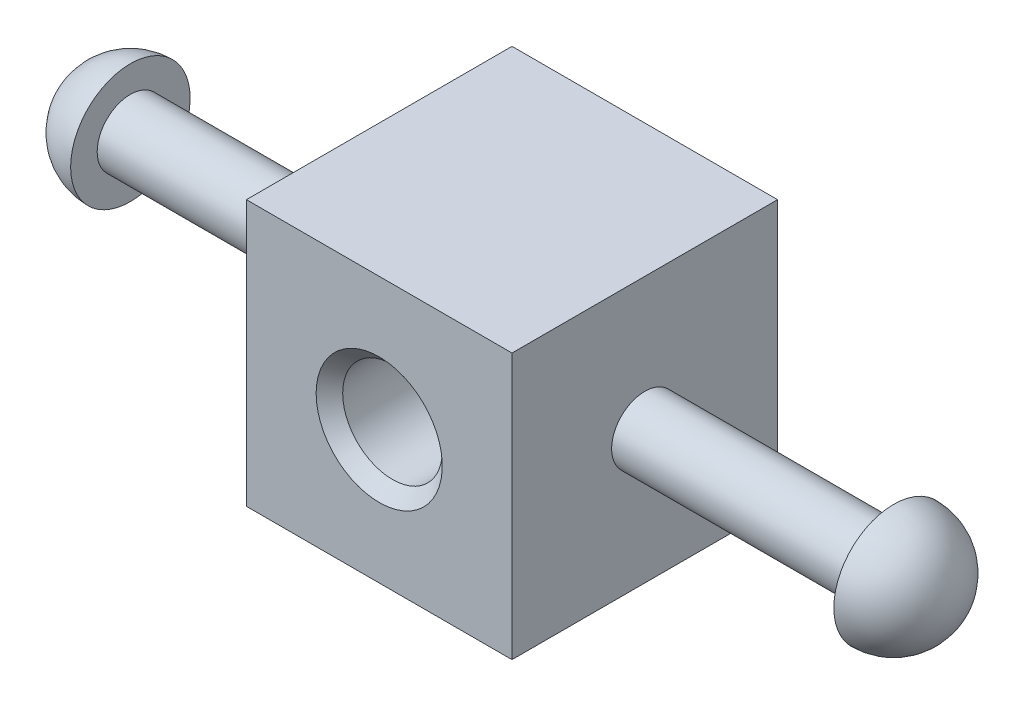
ISO-10303-21;
HEADER;
FILE_DESCRIPTION(('STEP AP214'),'2;1');
FILE_NAME('part.step','',(''),(''),'','','');
FILE_SCHEMA(('AUTOMOTIVE_DESIGN { 1 0 10303 214 1 1 1 1 }'));
ENDSEC;
DATA;
#1=APPLICATION_CONTEXT('core data for automotive mechanical design processes');
#2=APPLICATION_PROTOCOL_DEFINITION('international standard','automotive_design',2000,#1);
#3=PRODUCT_CONTEXT('',#1,'mechanical');
#4=PRODUCT('Part','Part','',(#3));
#5=PRODUCT_RELATED_PRODUCT_CATEGORY('part','',(#4));
#6=PRODUCT_DEFINITION_FORMATION('','',#4);
#7=PRODUCT_DEFINITION_CONTEXT('part definition',#1,'design');
#8=PRODUCT_DEFINITION('design','',#6,#7);
#9=PRODUCT_DEFINITION_SHAPE('','',#8);
#10=(LENGTH_UNIT() NAMED_UNIT(*) SI_UNIT(.MILLI.,.METRE.));
#11=(NAMED_UNIT(*) PLANE_ANGLE_UNIT() SI_UNIT($,.RADIAN.));
#12=(NAMED_UNIT(*) SI_UNIT($,.STERADIAN.) SOLID_ANGLE_UNIT());
#13=UNCERTAINTY_MEASURE_WITH_UNIT(LENGTH_MEASURE(1.E-05),#10,'distance_accuracy_value','');
#14=(GEOMETRIC_REPRESENTATION_CONTEXT(3) GLOBAL_UNCERTAINTY_ASSIGNED_CONTEXT((#13)) GLOBAL_UNIT_ASSIGNED_CONTEXT((#10,
#11,#12)) REPRESENTATION_CONTEXT('',''));
#15=CARTESIAN_POINT('',(0.,0.,0.));
#16=DIRECTION('',(0.,0.,1.));
#17=DIRECTION('',(1.,0.,0.));
#18=AXIS2_PLACEMENT_3D('',#15,#16,#17);
#19=CARTESIAN_POINT('',(12.7,25.4,12.7));
#20=DIRECTION('',(-1.,0.,0.));
#21=DIRECTION('',(0.,0.,1.));
#22=AXIS2_PLACEMENT_3D('',#19,#20,#21);
#23=PLANE('',#22);
#24=CARTESIAN_POINT('',(12.7,12.7,0.));
#25=DIRECTION('',(-1.,0.,0.));
#26=DIRECTION('',(0.,0.,1.));
#27=AXIS2_PLACEMENT_3D('',#24,#25,#26);
#28=CIRCLE('',#27,3.175);
#29=CARTESIAN_POINT('',(12.7,12.7,3.175));
#30=VERTEX_POINT('',#29);
#31=EDGE_CURVE('E363',#30,#30,#28,.T.);
#32=ORIENTED_EDGE('',*,*,#31,.T.);
#33=EDGE_LOOP('',(#32));
#34=FACE_BOUND('',#33,.T.);
#35=DIRECTION('',(0.,0.,-1.));
#36=VECTOR('',#35,1.);
#37=CARTESIAN_POINT('',(12.7,0.,12.7));
#38=LINE('',#37,#36);
#39=CARTESIAN_POINT('',(12.7,0.,12.7));
#40=VERTEX_POINT('',#39);
#41=CARTESIAN_POINT('',(12.7,0.,-12.7));
#42=VERTEX_POINT('',#41);
#43=EDGE_CURVE('E103',#40,#42,#38,.T.);
#44=ORIENTED_EDGE('',*,*,#43,.T.);
#45=DIRECTION('',(0.,-1.,0.));
#46=VECTOR('',#45,1.);
#47=CARTESIAN_POINT('',(12.7,25.4,-12.7));
#48=LINE('',#47,#46);
#49=CARTESIAN_POINT('',(12.7,25.4,-12.7));
#50=VERTEX_POINT('',#49);
#51=EDGE_CURVE('E94',#50,#42,#48,.T.);
#52=ORIENTED_EDGE('',*,*,#51,.F.);
#53=DIRECTION('',(0.,0.,-1.));
#54=VECTOR('',#53,1.);
#55=CARTESIAN_POINT('',(12.7,25.4,12.7));
#56=LINE('',#55,#54);
#57=CARTESIAN_POINT('',(12.7,25.4,12.7));
#58=VERTEX_POINT('',#57);
#59=EDGE_CURVE('E88',#58,#50,#56,.T.);
#60=ORIENTED_EDGE('',*,*,#59,.F.);
#61=DIRECTION('',(0.,-1.,0.));
#62=VECTOR('',#61,1.);
#63=CARTESIAN_POINT('',(12.7,25.4,12.7));
#64=LINE('',#63,#62);
#65=EDGE_CURVE('E99',#58,#40,#64,.T.);
#66=ORIENTED_EDGE('',*,*,#65,.T.);
#67=EDGE_LOOP('',(#44,#52,#60,#66));
#68=FACE_BOUND('',#67,.T.);
#69=ADVANCED_FACE('F34',(#34,#68),#23,.F.);
#70=CARTESIAN_POINT('',(-12.7,25.4,-12.7));
#71=DIRECTION('',(0.,0.,1.));
#72=DIRECTION('',(1.,0.,0.));
#73=AXIS2_PLACEMENT_3D('',#70,#71,#72);
#74=PLANE('',#73);
#75=CARTESIAN_POINT('',(0.,12.7,-12.7));
#76=DIRECTION('',(0.,0.,1.));
#77=DIRECTION('',(1.,0.,0.));
#78=AXIS2_PLACEMENT_3D('',#75,#76,#77);
#79=CIRCLE('',#78,6.0325);
#80=CARTESIAN_POINT('',(6.0325,12.7,-12.7));
#81=VERTEX_POINT('',#80);
#82=EDGE_CURVE('E119',#81,#81,#79,.T.);
#83=ORIENTED_EDGE('',*,*,#82,.T.);
#84=EDGE_LOOP('',(#83));
#85=FACE_BOUND('',#84,.T.);
#86=DIRECTION('',(-1.,0.,0.));
#87=VECTOR('',#86,1.);
#88=CARTESIAN_POINT('',(-12.7,0.,-12.7));
#89=LINE('',#88,#87);
#90=CARTESIAN_POINT('',(-12.7,0.,-12.7));
#91=VERTEX_POINT('',#90);
#92=EDGE_CURVE('E93',#42,#91,#89,.T.);
#93=ORIENTED_EDGE('',*,*,#92,.T.);
#94=DIRECTION('',(0.,-1.,0.));
#95=VECTOR('',#94,1.);
#96=CARTESIAN_POINT('',(-12.7,25.4,-12.7));
#97=LINE('',#96,#95);
#98=CARTESIAN_POINT('',(-12.7,25.4,-12.7));
#99=VERTEX_POINT('',#98);
#100=EDGE_CURVE('E91',#99,#91,#97,.T.);
#101=ORIENTED_EDGE('',*,*,#100,.F.);
#102=DIRECTION('',(-1.,0.,0.));
#103=VECTOR('',#102,1.);
#104=CARTESIAN_POINT('',(-12.7,25.4,-12.7));
#105=LINE('',#104,#103);
#106=EDGE_CURVE('E83',#50,#99,#105,.T.);
#107=ORIENTED_EDGE('',*,*,#106,.F.);
#108=ORIENTED_EDGE('',*,*,#51,.T.);
#109=EDGE_LOOP('',(#93,#101,#107,#108));
#110=FACE_BOUND('',#109,.T.);
#111=ADVANCED_FACE('F92',(#85,#110),#74,.F.);
#112=CARTESIAN_POINT('',(-12.7,25.4,12.7));
#113=DIRECTION('',(1.,0.,0.));
#114=DIRECTION('',(0.,0.,-1.));
#115=AXIS2_PLACEMENT_3D('',#112,#113,#114);
#116=PLANE('',#115);
#117=CARTESIAN_POINT('',(-12.7,12.7,0.));
#118=DIRECTION('',(-1.,0.,0.));
#119=DIRECTION('',(0.,0.,1.));
#120=AXIS2_PLACEMENT_3D('',#117,#118,#119);
#121=CIRCLE('',#120,3.175);
#122=CARTESIAN_POINT('',(-12.7,12.7,3.175));
#123=VERTEX_POINT('',#122);
#124=EDGE_CURVE('E380',#123,#123,#121,.T.);
#125=ORIENTED_EDGE('',*,*,#124,.F.);
#126=EDGE_LOOP('',(#125));
#127=FACE_BOUND('',#126,.T.);
#128=DIRECTION('',(0.,0.,1.));
#129=VECTOR('',#128,1.);
#130=CARTESIAN_POINT('',(-12.7,0.,12.7));
#131=LINE('',#130,#129);
#132=CARTESIAN_POINT('',(-12.7,0.,12.7));
#133=VERTEX_POINT('',#132);
#134=EDGE_CURVE('E69',#91,#133,#131,.T.);
#135=ORIENTED_EDGE('',*,*,#134,.T.);
#136=DIRECTION('',(0.,-1.,0.));
#137=VECTOR('',#136,1.);
#138=CARTESIAN_POINT('',(-12.7,25.4,12.7));
#139=LINE('',#138,#137);
#140=CARTESIAN_POINT('',(-12.7,25.4,12.7));
#141=VERTEX_POINT('',#140);
#142=EDGE_CURVE('E95',#141,#133,#139,.T.);
#143=ORIENTED_EDGE('',*,*,#142,.F.);
#144=DIRECTION('',(0.,0.,1.));
#145=VECTOR('',#144,1.);
#146=CARTESIAN_POINT('',(-12.7,25.4,12.7));
#147=LINE('',#146,#145);
#148=EDGE_CURVE('E86',#99,#141,#147,.T.);
#149=ORIENTED_EDGE('',*,*,#148,.F.);
#150=ORIENTED_EDGE('',*,*,#100,.T.);
#151=EDGE_LOOP('',(#135,#143,#149,#150));
#152=FACE_BOUND('',#151,.T.);
#153=ADVANCED_FACE('F97',(#127,#152),#116,.F.);
#154=CARTESIAN_POINT('',(-12.7,25.4,12.7));
#155=DIRECTION('',(0.,0.,-1.));
#156=DIRECTION('',(-1.,0.,0.));
#157=AXIS2_PLACEMENT_3D('',#154,#155,#156);
#158=PLANE('',#157);
#159=CARTESIAN_POINT('',(0.,12.7,12.7));
#160=DIRECTION('',(0.,0.,-1.));
#161=DIRECTION('',(-1.,0.,0.));
#162=AXIS2_PLACEMENT_3D('',#159,#160,#161);
#163=CIRCLE('',#162,6.0325);
#164=CARTESIAN_POINT('',(-6.0325,12.7,12.7));
#165=VERTEX_POINT('',#164);
#166=EDGE_CURVE('E116',#165,#165,#163,.T.);
#167=ORIENTED_EDGE('',*,*,#166,.T.);
#168=EDGE_LOOP('',(#167));
#169=FACE_BOUND('',#168,.T.);
#170=DIRECTION('',(1.,0.,0.));
#171=VECTOR('',#170,1.);
#172=CARTESIAN_POINT('',(-12.7,0.,12.7));
#173=LINE('',#172,#171);
#174=EDGE_CURVE('E75',#133,#40,#173,.T.);
#175=ORIENTED_EDGE('',*,*,#174,.T.);
#176=ORIENTED_EDGE('',*,*,#65,.F.);
#177=DIRECTION('',(1.,0.,0.));
#178=VECTOR('',#177,1.);
#179=CARTESIAN_POINT('',(-12.7,25.4,12.7));
#180=LINE('',#179,#178);
#181=EDGE_CURVE('E52',#141,#58,#180,.T.);
#182=ORIENTED_EDGE('',*,*,#181,.F.);
#183=ORIENTED_EDGE('',*,*,#142,.T.);
#184=EDGE_LOOP('',(#175,#176,#182,#183));
#185=FACE_BOUND('',#184,.T.);
#186=ADVANCED_FACE('F167',(#169,#185),#158,.F.);
#187=CARTESIAN_POINT('',(0.,25.4,0.));
#188=DIRECTION('',(0.,-1.,0.));
#189=DIRECTION('',(0.,0.,-1.));
#190=AXIS2_PLACEMENT_3D('',#187,#188,#189);
#191=PLANE('',#190);
#192=ORIENTED_EDGE('',*,*,#59,.T.);
#193=ORIENTED_EDGE('',*,*,#106,.T.);
#194=ORIENTED_EDGE('',*,*,#148,.T.);
#195=ORIENTED_EDGE('',*,*,#181,.T.);
#196=EDGE_LOOP('',(#192,#193,#194,#195));
#197=FACE_BOUND('',#196,.T.);
#198=ADVANCED_FACE('F84',(#197),#191,.F.);
#199=CARTESIAN_POINT('',(0.,0.,0.));
#200=DIRECTION('',(0.,-1.,0.));
#201=DIRECTION('',(0.,0.,-1.));
#202=AXIS2_PLACEMENT_3D('',#199,#200,#201);
#203=PLANE('',#202);
#204=ORIENTED_EDGE('',*,*,#43,.F.);
#205=ORIENTED_EDGE('',*,*,#174,.F.);
#206=ORIENTED_EDGE('',*,*,#134,.F.);
#207=ORIENTED_EDGE('',*,*,#92,.F.);
#208=EDGE_LOOP('',(#204,#205,#206,#207));
#209=FACE_BOUND('',#208,.T.);
#210=ADVANCED_FACE('F163',(#209),#203,.T.);
#211=CARTESIAN_POINT('',(0.,12.7,-12.7));
#212=DIRECTION('',(0.,0.,1.));
#213=DIRECTION('',(1.,0.,0.));
#214=AXIS2_PLACEMENT_3D('',#211,#212,#213);
#215=CYLINDRICAL_SURFACE('',#214,4.7625);
#216=CARTESIAN_POINT('',(0.,12.7,-11.43));
#217=DIRECTION('',(0.,0.,1.));
#218=DIRECTION('',(1.,0.,0.));
#219=AXIS2_PLACEMENT_3D('',#216,#217,#218);
#220=CIRCLE('',#219,4.7625);
#221=CARTESIAN_POINT('',(4.7625,12.7,-11.43));
#222=VERTEX_POINT('',#221);
#223=EDGE_CURVE('E122',#222,#222,#220,.F.);
#224=ORIENTED_EDGE('',*,*,#223,.T.);
#225=EDGE_LOOP('',(#224));
#226=FACE_BOUND('',#225,.T.);
#227=CARTESIAN_POINT('',(0.,12.7,11.43));
#228=DIRECTION('',(0.,0.,-1.));
#229=DIRECTION('',(-1.,0.,0.));
#230=AXIS2_PLACEMENT_3D('',#227,#228,#229);
#231=CIRCLE('',#230,4.7625);
#232=CARTESIAN_POINT('',(-4.7625,12.7,11.43));
#233=VERTEX_POINT('',#232);
#234=EDGE_CURVE('E113',#233,#233,#231,.F.);
#235=ORIENTED_EDGE('',*,*,#234,.T.);
#236=EDGE_LOOP('',(#235));
#237=FACE_BOUND('',#236,.T.);
#238=ADVANCED_FACE('F159',(#226,#237),#215,.F.);
#239=CARTESIAN_POINT('',(0.,12.7,11.43));
#240=DIRECTION('',(0.,0.,1.));
#241=DIRECTION('',(1.,0.,0.));
#242=AXIS2_PLACEMENT_3D('',#239,#240,#241);
#243=CONICAL_SURFACE('',#242,4.7625,0.785398163397451);
#244=ORIENTED_EDGE('',*,*,#166,.F.);
#245=EDGE_LOOP('',(#244));
#246=FACE_BOUND('',#245,.T.);
#247=ORIENTED_EDGE('',*,*,#234,.F.);
#248=EDGE_LOOP('',(#247));
#249=FACE_BOUND('',#248,.T.);
#250=ADVANCED_FACE('F162',(#246,#249),#243,.F.);
#251=CARTESIAN_POINT('',(0.,12.7,-12.7));
#252=DIRECTION('',(0.,0.,-1.));
#253=DIRECTION('',(-1.,0.,0.));
#254=AXIS2_PLACEMENT_3D('',#251,#252,#253);
#255=CONICAL_SURFACE('',#254,6.0325,0.785398163397447);
#256=ORIENTED_EDGE('',*,*,#223,.F.);
#257=EDGE_LOOP('',(#256));
#258=FACE_BOUND('',#257,.T.);
#259=ORIENTED_EDGE('',*,*,#82,.F.);
#260=EDGE_LOOP('',(#259));
#261=FACE_BOUND('',#260,.T.);
#262=ADVANCED_FACE('F36',(#258,#261),#255,.F.);
#263=CARTESIAN_POINT('',(36.4970530434461,12.7,0.));
#264=DIRECTION('',(-1.,0.,0.));
#265=DIRECTION('',(0.,1.,0.));
#266=AXIS2_PLACEMENT_3D('',#263,#264,#265);
#267=SPHERICAL_SURFACE('',#266,5.715);
#268=CARTESIAN_POINT('',(36.4970530434461,12.7,0.));
#269=DIRECTION('',(-1.,0.,0.));
#270=DIRECTION('',(0.,0.,1.));
#271=AXIS2_PLACEMENT_3D('',#268,#269,#270);
#272=CIRCLE('',#271,5.715);
#273=CARTESIAN_POINT('',(36.4970530434461,12.7,5.715));
#274=VERTEX_POINT('',#273);
#275=EDGE_CURVE('E106',#274,#274,#272,.T.);
#276=ORIENTED_EDGE('',*,*,#275,.F.);
#277=EDGE_LOOP('',(#276));
#278=FACE_BOUND('',#277,.T.);
#279=ADVANCED_FACE('F157',(#278),#267,.T.);
#280=CARTESIAN_POINT('',(36.4970530434461,15.875,0.));
#281=DIRECTION('',(-1.,0.,0.));
#282=DIRECTION('',(0.,0.,1.));
#283=AXIS2_PLACEMENT_3D('',#280,#281,#282);
#284=PLANE('',#283);
#285=ORIENTED_EDGE('',*,*,#275,.T.);
#286=EDGE_LOOP('',(#285));
#287=FACE_BOUND('',#286,.T.);
#288=CARTESIAN_POINT('',(36.4970530434461,12.7,0.));
#289=DIRECTION('',(-1.,0.,0.));
#290=DIRECTION('',(0.,0.,1.));
#291=AXIS2_PLACEMENT_3D('',#288,#289,#290);
#292=CIRCLE('',#291,3.175);
#293=CARTESIAN_POINT('',(36.4970530434461,12.7,3.175));
#294=VERTEX_POINT('',#293);
#295=EDGE_CURVE('E362',#294,#294,#292,.T.);
#296=ORIENTED_EDGE('',*,*,#295,.F.);
#297=EDGE_LOOP('',(#296));
#298=FACE_BOUND('',#297,.T.);
#299=ADVANCED_FACE('F189',(#287,#298),#284,.T.);
#300=CARTESIAN_POINT('',(12.7,12.7,0.));
#301=DIRECTION('',(-1.,0.,0.));
#302=DIRECTION('',(0.,0.,1.));
#303=AXIS2_PLACEMENT_3D('',#300,#301,#302);
#304=CYLINDRICAL_SURFACE('',#303,3.175);
#305=ORIENTED_EDGE('',*,*,#295,.T.);
#306=EDGE_LOOP('',(#305));
#307=FACE_BOUND('',#306,.T.);
#308=ORIENTED_EDGE('',*,*,#31,.F.);
#309=EDGE_LOOP('',(#308));
#310=FACE_BOUND('',#309,.T.);
#311=ADVANCED_FACE('F234',(#307,#310),#304,.T.);
#312=CARTESIAN_POINT('',(-36.4970530434461,12.7,0.));
#313=DIRECTION('',(1.,0.,0.));
#314=DIRECTION('',(0.,1.,0.));
#315=AXIS2_PLACEMENT_3D('',#312,#313,#314);
#316=SPHERICAL_SURFACE('',#315,5.715);
#317=CARTESIAN_POINT('',(-36.4970530434461,12.7,0.));
#318=DIRECTION('',(-1.,0.,0.));
#319=DIRECTION('',(0.,0.,1.));
#320=AXIS2_PLACEMENT_3D('',#317,#318,#319);
#321=CIRCLE('',#320,5.715);
#322=CARTESIAN_POINT('',(-36.4970530434461,12.7,5.715));
#323=VERTEX_POINT('',#322);
#324=EDGE_CURVE('E374',#323,#323,#321,.T.);
#325=ORIENTED_EDGE('',*,*,#324,.T.);
#326=EDGE_LOOP('',(#325));
#327=FACE_BOUND('',#326,.T.);
#328=ADVANCED_FACE('F228',(#327),#316,.T.);
#329=CARTESIAN_POINT('',(-36.4970530434461,15.875,0.));
#330=DIRECTION('',(1.,0.,0.));
#331=DIRECTION('',(0.,0.,1.));
#332=AXIS2_PLACEMENT_3D('',#329,#330,#331);
#333=PLANE('',#332);
#334=ORIENTED_EDGE('',*,*,#324,.F.);
#335=EDGE_LOOP('',(#334));
#336=FACE_BOUND('',#335,.T.);
#337=CARTESIAN_POINT('',(-36.4970530434461,12.7,0.));
#338=DIRECTION('',(-1.,0.,0.));
#339=DIRECTION('',(0.,0.,1.));
#340=AXIS2_PLACEMENT_3D('',#337,#338,#339);
#341=CIRCLE('',#340,3.175);
#342=CARTESIAN_POINT('',(-36.4970530434461,12.7,3.175));
#343=VERTEX_POINT('',#342);
#344=EDGE_CURVE('E377',#343,#343,#341,.T.);
#345=ORIENTED_EDGE('',*,*,#344,.T.);
#346=EDGE_LOOP('',(#345));
#347=FACE_BOUND('',#346,.T.);
#348=ADVANCED_FACE('F233',(#336,#347),#333,.T.);
#349=CARTESIAN_POINT('',(-12.7,12.7,0.));
#350=DIRECTION('',(1.,0.,0.));
#351=DIRECTION('',(0.,0.,1.));
#352=AXIS2_PLACEMENT_3D('',#349,#350,#351);
#353=CYLINDRICAL_SURFACE('',#352,3.175);
#354=ORIENTED_EDGE('',*,*,#344,.F.);
#355=EDGE_LOOP('',(#354));
#356=FACE_BOUND('',#355,.T.);
#357=ORIENTED_EDGE('',*,*,#124,.T.);
#358=EDGE_LOOP('',(#357));
#359=FACE_BOUND('',#358,.T.);
#360=ADVANCED_FACE('F246',(#356,#359),#353,.T.);
#361=CLOSED_SHELL('',(#69,#111,#153,#186,#198,#210,#238,#250,#262,#279,#299,#311,#328,#348,#360));
#362=CARTESIAN_POINT('',(-36.4970530434461,12.7,0.));
#363=DIRECTION('',(1.,0.,0.));
#364=DIRECTION('',(0.,1.,0.));
#365=AXIS2_PLACEMENT_3D('',#362,#363,#364);
#366=SPHERICAL_SURFACE('',#365,3.175);
#367=CARTESIAN_POINT('',(-39.0370530434461,12.7,0.));
#368=DIRECTION('',(-1.,0.,0.));
#369=DIRECTION('',(0.,0.,1.));
#370=AXIS2_PLACEMENT_3D('',#367,#368,#369);
#371=CIRCLE('',#370,1.905);
#372=CARTESIAN_POINT('',(-39.0370530434461,12.7,1.905));
#373=VERTEX_POINT('',#372);
#374=EDGE_CURVE('E386',#373,#373,#371,.T.);
#375=ORIENTED_EDGE('',*,*,#374,.F.);
#376=EDGE_LOOP('',(#375));
#377=FACE_BOUND('',#376,.T.);
#378=ADVANCED_FACE('F263',(#377),#366,.F.);
#379=CARTESIAN_POINT('',(-39.0370530434461,15.875,0.));
#380=DIRECTION('',(1.,0.,0.));
#381=DIRECTION('',(0.,0.,1.));
#382=AXIS2_PLACEMENT_3D('',#379,#380,#381);
#383=PLANE('',#382);
#384=ORIENTED_EDGE('',*,*,#374,.T.);
#385=EDGE_LOOP('',(#384));
#386=FACE_BOUND('',#385,.T.);
#387=CARTESIAN_POINT('',(-39.0370530434461,12.7,0.));
#388=DIRECTION('',(-1.,0.,0.));
#389=DIRECTION('',(0.,0.,1.));
#390=AXIS2_PLACEMENT_3D('',#387,#388,#389);
#391=CIRCLE('',#390,0.635);
#392=CARTESIAN_POINT('',(-39.0370530434461,12.7,0.635));
#393=VERTEX_POINT('',#392);
#394=EDGE_CURVE('E383',#393,#393,#391,.T.);
#395=ORIENTED_EDGE('',*,*,#394,.F.);
#396=EDGE_LOOP('',(#395));
#397=FACE_BOUND('',#396,.T.);
#398=ADVANCED_FACE('F266',(#386,#397),#383,.F.);
#399=CARTESIAN_POINT('',(-12.7,12.7,0.));
#400=DIRECTION('',(1.,0.,0.));
#401=DIRECTION('',(0.,0.,1.));
#402=AXIS2_PLACEMENT_3D('',#399,#400,#401);
#403=CYLINDRICAL_SURFACE('',#402,0.635);
#404=ORIENTED_EDGE('',*,*,#394,.T.);
#405=EDGE_LOOP('',(#404));
#406=FACE_BOUND('',#405,.T.);
#407=CARTESIAN_POINT('',(-12.7,12.7,0.));
#408=DIRECTION('',(1.,0.,0.));
#409=DIRECTION('',(0.,0.,-1.));
#410=AXIS2_PLACEMENT_3D('',#407,#408,#409);
#411=CIRCLE('',#410,0.635);
#412=CARTESIAN_POINT('',(-12.7,12.7,-0.635));
#413=VERTEX_POINT('',#412);
#414=EDGE_CURVE('E11',#413,#413,#411,.T.);
#415=ORIENTED_EDGE('',*,*,#414,.T.);
#416=EDGE_LOOP('',(#415));
#417=FACE_BOUND('',#416,.T.);
#418=ADVANCED_FACE('F277',(#406,#417),#403,.F.);
#419=ORIENTED_EDGE('',*,*,#414,.F.);
#420=EDGE_LOOP('',(#419));
#421=FACE_BOUND('',#420,.T.);
#422=ADVANCED_FACE('F176',(#421),#116,.F.);
#423=CLOSED_SHELL('',(#378,#398,#418,#422));
#424=CARTESIAN_POINT('',(36.4970530434461,12.7,0.));
#425=DIRECTION('',(-1.,0.,0.));
#426=DIRECTION('',(0.,1.,0.));
#427=AXIS2_PLACEMENT_3D('',#424,#425,#426);
#428=SPHERICAL_SURFACE('',#427,3.175);
#429=CARTESIAN_POINT('',(39.0370530434461,12.7,0.));
#430=DIRECTION('',(-1.,0.,0.));
#431=DIRECTION('',(0.,0.,1.));
#432=AXIS2_PLACEMENT_3D('',#429,#430,#431);
#433=CIRCLE('',#432,1.905);
#434=CARTESIAN_POINT('',(39.0370530434461,12.7,1.905));
#435=VERTEX_POINT('',#434);
#436=EDGE_CURVE('E372',#435,#435,#433,.T.);
#437=ORIENTED_EDGE('',*,*,#436,.T.);
#438=EDGE_LOOP('',(#437));
#439=FACE_BOUND('',#438,.T.);
#440=ADVANCED_FACE('F140',(#439),#428,.F.);
#441=CARTESIAN_POINT('',(39.0370530434461,15.875,0.));
#442=DIRECTION('',(-1.,0.,0.));
#443=DIRECTION('',(0.,0.,1.));
#444=AXIS2_PLACEMENT_3D('',#441,#442,#443);
#445=PLANE('',#444);
#446=ORIENTED_EDGE('',*,*,#436,.F.);
#447=EDGE_LOOP('',(#446));
#448=FACE_BOUND('',#447,.T.);
#449=CARTESIAN_POINT('',(39.0370530434461,12.7,0.));
#450=DIRECTION('',(-1.,0.,0.));
#451=DIRECTION('',(0.,0.,1.));
#452=AXIS2_PLACEMENT_3D('',#449,#450,#451);
#453=CIRCLE('',#452,0.635);
#454=CARTESIAN_POINT('',(39.0370530434461,12.7,0.635));
#455=VERTEX_POINT('',#454);
#456=EDGE_CURVE('E367',#455,#455,#453,.T.);
#457=ORIENTED_EDGE('',*,*,#456,.T.);
#458=EDGE_LOOP('',(#457));
#459=FACE_BOUND('',#458,.T.);
#460=ADVANCED_FACE('F137',(#448,#459),#445,.F.);
#461=CARTESIAN_POINT('',(12.7,12.7,0.));
#462=DIRECTION('',(-1.,0.,0.));
#463=DIRECTION('',(0.,0.,1.));
#464=AXIS2_PLACEMENT_3D('',#461,#462,#463);
#465=CYLINDRICAL_SURFACE('',#464,0.635);
#466=ORIENTED_EDGE('',*,*,#456,.F.);
#467=EDGE_LOOP('',(#466));
#468=FACE_BOUND('',#467,.T.);
#469=CARTESIAN_POINT('',(12.7,12.7,0.));
#470=DIRECTION('',(-1.,0.,0.));
#471=DIRECTION('',(0.,0.,1.));
#472=AXIS2_PLACEMENT_3D('',#469,#470,#471);
#473=CIRCLE('',#472,0.635);
#474=CARTESIAN_POINT('',(12.7,12.7,0.635));
#475=VERTEX_POINT('',#474);
#476=EDGE_CURVE('E44',#475,#475,#473,.T.);
#477=ORIENTED_EDGE('',*,*,#476,.T.);
#478=EDGE_LOOP('',(#477));
#479=FACE_BOUND('',#478,.T.);
#480=ADVANCED_FACE('F127',(#468,#479),#465,.F.);
#481=ORIENTED_EDGE('',*,*,#476,.F.);
#482=EDGE_LOOP('',(#481));
#483=FACE_BOUND('',#482,.T.);
#484=ADVANCED_FACE('F129',(#483),#23,.F.);
#485=CLOSED_SHELL('',(#440,#460,#480,#484));
#486=ORIENTED_CLOSED_SHELL('',*,#423,.T.);
#487=ORIENTED_CLOSED_SHELL('',*,#485,.T.);
#488=BREP_WITH_VOIDS('B2',#361,(#486,#487));
#489=ADVANCED_BREP_SHAPE_REPRESENTATION('',(#18,#488),#14);
#490=SHAPE_DEFINITION_REPRESENTATION(#9,#489);
ENDSEC;
END-ISO-10303-21;
